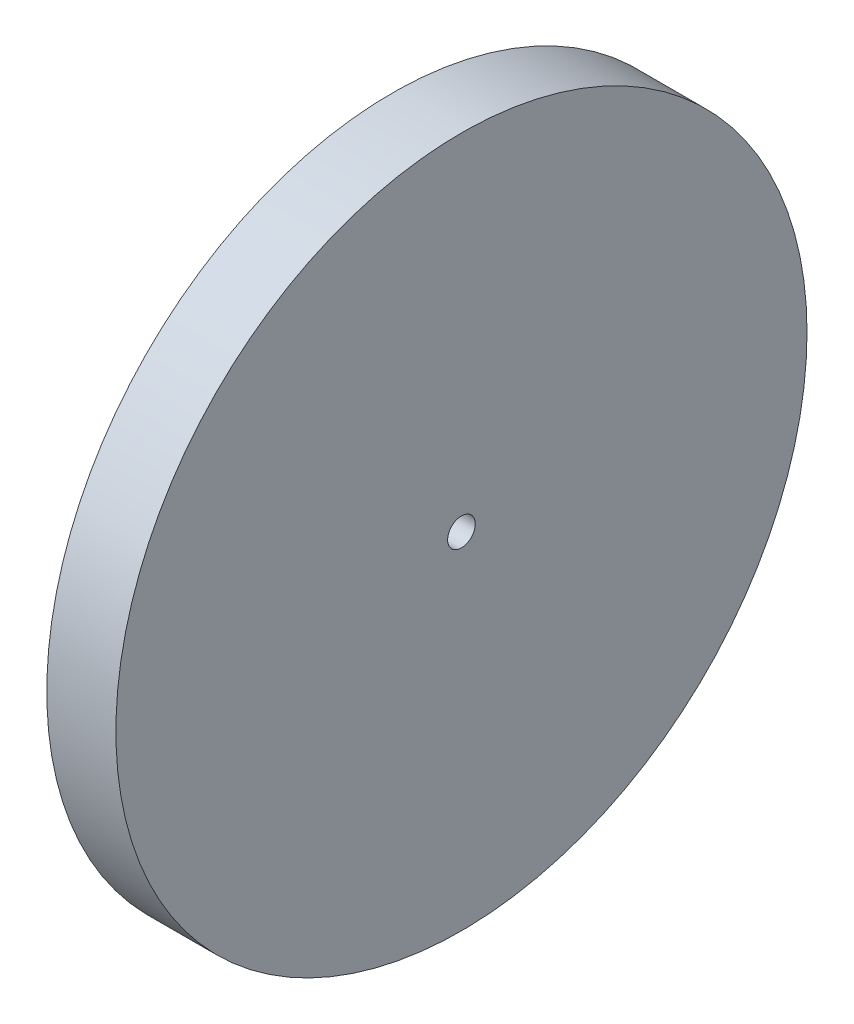
ISO-10303-21;
HEADER;
FILE_DESCRIPTION(('STEP AP214'),'2;1');
FILE_NAME('part.step','',(''),(''),'','','');
FILE_SCHEMA(('AUTOMOTIVE_DESIGN { 1 0 10303 214 1 1 1 1 }'));
ENDSEC;
DATA;
#1=APPLICATION_CONTEXT('core data for automotive mechanical design processes');
#2=APPLICATION_PROTOCOL_DEFINITION('international standard','automotive_design',2000,#1);
#3=PRODUCT_CONTEXT('',#1,'mechanical');
#4=PRODUCT('Part','Part','',(#3));
#5=PRODUCT_RELATED_PRODUCT_CATEGORY('part','',(#4));
#6=PRODUCT_DEFINITION_FORMATION('','',#4);
#7=PRODUCT_DEFINITION_CONTEXT('part definition',#1,'design');
#8=PRODUCT_DEFINITION('design','',#6,#7);
#9=PRODUCT_DEFINITION_SHAPE('','',#8);
#10=(LENGTH_UNIT() NAMED_UNIT(*) SI_UNIT(.MILLI.,.METRE.));
#11=(NAMED_UNIT(*) PLANE_ANGLE_UNIT() SI_UNIT($,.RADIAN.));
#12=(NAMED_UNIT(*) SI_UNIT($,.STERADIAN.) SOLID_ANGLE_UNIT());
#13=UNCERTAINTY_MEASURE_WITH_UNIT(LENGTH_MEASURE(1.E-05),#10,'distance_accuracy_value','');
#14=(GEOMETRIC_REPRESENTATION_CONTEXT(3) GLOBAL_UNCERTAINTY_ASSIGNED_CONTEXT((#13)) GLOBAL_UNIT_ASSIGNED_CONTEXT((#10,
#11,#12)) REPRESENTATION_CONTEXT('',''));
#15=CARTESIAN_POINT('',(0.,0.,0.));
#16=DIRECTION('',(0.,0.,1.));
#17=DIRECTION('',(1.,0.,0.));
#18=AXIS2_PLACEMENT_3D('',#15,#16,#17);
#19=CARTESIAN_POINT('',(20.,0.,0.));
#20=DIRECTION('',(-1.,0.,0.));
#21=DIRECTION('',(0.,0.,1.));
#22=AXIS2_PLACEMENT_3D('',#19,#20,#21);
#23=CYLINDRICAL_SURFACE('',#22,100.);
#24=CARTESIAN_POINT('',(20.,0.,0.));
#25=DIRECTION('',(1.,0.,0.));
#26=DIRECTION('',(0.,0.,-1.));
#27=AXIS2_PLACEMENT_3D('',#24,#25,#26);
#28=CIRCLE('',#27,100.);
#29=CARTESIAN_POINT('',(20.,0.,-100.));
#30=VERTEX_POINT('',#29);
#31=EDGE_CURVE('E45',#30,#30,#28,.T.);
#32=ORIENTED_EDGE('',*,*,#31,.F.);
#33=EDGE_LOOP('',(#32));
#34=FACE_BOUND('',#33,.T.);
#35=CARTESIAN_POINT('',(0.,0.,0.));
#36=DIRECTION('',(1.,0.,0.));
#37=DIRECTION('',(0.,0.,-1.));
#38=AXIS2_PLACEMENT_3D('',#35,#36,#37);
#39=CIRCLE('',#38,100.);
#40=CARTESIAN_POINT('',(0.,0.,-100.));
#41=VERTEX_POINT('',#40);
#42=EDGE_CURVE('E40',#41,#41,#39,.T.);
#43=ORIENTED_EDGE('',*,*,#42,.T.);
#44=EDGE_LOOP('',(#43));
#45=FACE_BOUND('',#44,.T.);
#46=ADVANCED_FACE('F37',(#34,#45),#23,.T.);
#47=CARTESIAN_POINT('',(20.,0.,0.));
#48=DIRECTION('',(1.,0.,0.));
#49=DIRECTION('',(0.,0.,-1.));
#50=AXIS2_PLACEMENT_3D('',#47,#48,#49);
#51=PLANE('',#50);
#52=CARTESIAN_POINT('',(20.,0.,0.));
#53=DIRECTION('',(1.,0.,0.));
#54=DIRECTION('',(0.,0.,-1.));
#55=AXIS2_PLACEMENT_3D('',#52,#53,#54);
#56=CIRCLE('',#55,4.);
#57=CARTESIAN_POINT('',(20.,0.,-4.));
#58=VERTEX_POINT('',#57);
#59=EDGE_CURVE('E57',#58,#58,#56,.F.);
#60=ORIENTED_EDGE('',*,*,#59,.T.);
#61=EDGE_LOOP('',(#60));
#62=FACE_BOUND('',#61,.T.);
#63=ORIENTED_EDGE('',*,*,#31,.T.);
#64=EDGE_LOOP('',(#63));
#65=FACE_BOUND('',#64,.T.);
#66=ADVANCED_FACE('F80',(#62,#65),#51,.T.);
#67=CARTESIAN_POINT('',(0.,0.,0.));
#68=DIRECTION('',(1.,0.,0.));
#69=DIRECTION('',(0.,0.,-1.));
#70=AXIS2_PLACEMENT_3D('',#67,#68,#69);
#71=PLANE('',#70);
#72=CARTESIAN_POINT('',(0.,0.,0.));
#73=DIRECTION('',(-1.,0.,0.));
#74=DIRECTION('',(0.,0.,1.));
#75=AXIS2_PLACEMENT_3D('',#72,#73,#74);
#76=CIRCLE('',#75,70.);
#77=CARTESIAN_POINT('',(0.,0.,70.));
#78=VERTEX_POINT('',#77);
#79=EDGE_CURVE('E10',#78,#78,#76,.T.);
#80=ORIENTED_EDGE('',*,*,#79,.F.);
#81=EDGE_LOOP('',(#80));
#82=FACE_BOUND('',#81,.T.);
#83=ORIENTED_EDGE('',*,*,#42,.F.);
#84=EDGE_LOOP('',(#83));
#85=FACE_BOUND('',#84,.T.);
#86=ADVANCED_FACE('F75',(#82,#85),#71,.F.);
#87=CARTESIAN_POINT('',(-20.,0.,0.));
#88=DIRECTION('',(1.,0.,0.));
#89=DIRECTION('',(0.,0.,-1.));
#90=AXIS2_PLACEMENT_3D('',#87,#88,#89);
#91=CYLINDRICAL_SURFACE('',#90,70.);
#92=CARTESIAN_POINT('',(-20.,0.,0.));
#93=DIRECTION('',(-1.,0.,0.));
#94=DIRECTION('',(0.,0.,1.));
#95=AXIS2_PLACEMENT_3D('',#92,#93,#94);
#96=CIRCLE('',#95,70.);
#97=CARTESIAN_POINT('',(-20.,0.,70.));
#98=VERTEX_POINT('',#97);
#99=EDGE_CURVE('E52',#98,#98,#96,.T.);
#100=ORIENTED_EDGE('',*,*,#99,.F.);
#101=EDGE_LOOP('',(#100));
#102=FACE_BOUND('',#101,.T.);
#103=ORIENTED_EDGE('',*,*,#79,.T.);
#104=EDGE_LOOP('',(#103));
#105=FACE_BOUND('',#104,.T.);
#106=ADVANCED_FACE('F70',(#102,#105),#91,.T.);
#107=CARTESIAN_POINT('',(-20.,0.,0.));
#108=DIRECTION('',(-1.,0.,0.));
#109=DIRECTION('',(0.,0.,1.));
#110=AXIS2_PLACEMENT_3D('',#107,#108,#109);
#111=PLANE('',#110);
#112=CARTESIAN_POINT('',(-20.,0.,0.));
#113=DIRECTION('',(-1.,0.,0.));
#114=DIRECTION('',(0.,0.,1.));
#115=AXIS2_PLACEMENT_3D('',#112,#113,#114);
#116=CIRCLE('',#115,4.);
#117=CARTESIAN_POINT('',(-20.,0.,4.));
#118=VERTEX_POINT('',#117);
#119=EDGE_CURVE('E56',#118,#118,#116,.T.);
#120=ORIENTED_EDGE('',*,*,#119,.F.);
#121=EDGE_LOOP('',(#120));
#122=FACE_BOUND('',#121,.T.);
#123=ORIENTED_EDGE('',*,*,#99,.T.);
#124=EDGE_LOOP('',(#123));
#125=FACE_BOUND('',#124,.T.);
#126=ADVANCED_FACE('F67',(#122,#125),#111,.T.);
#127=CARTESIAN_POINT('',(20.001,0.,0.));
#128=DIRECTION('',(-1.,0.,0.));
#129=DIRECTION('',(0.,0.,1.));
#130=AXIS2_PLACEMENT_3D('',#127,#128,#129);
#131=CYLINDRICAL_SURFACE('',#130,4.);
#132=ORIENTED_EDGE('',*,*,#59,.F.);
#133=EDGE_LOOP('',(#132));
#134=FACE_BOUND('',#133,.T.);
#135=ORIENTED_EDGE('',*,*,#119,.T.);
#136=EDGE_LOOP('',(#135));
#137=FACE_BOUND('',#136,.T.);
#138=ADVANCED_FACE('F65',(#134,#137),#131,.F.);
#139=CLOSED_SHELL('',(#46,#66,#86,#106,#126,#138));
#140=MANIFOLD_SOLID_BREP('B2',#139);
#141=ADVANCED_BREP_SHAPE_REPRESENTATION('',(#18,#140),#14);
#142=SHAPE_DEFINITION_REPRESENTATION(#9,#141);
ENDSEC;
END-ISO-10303-21;
